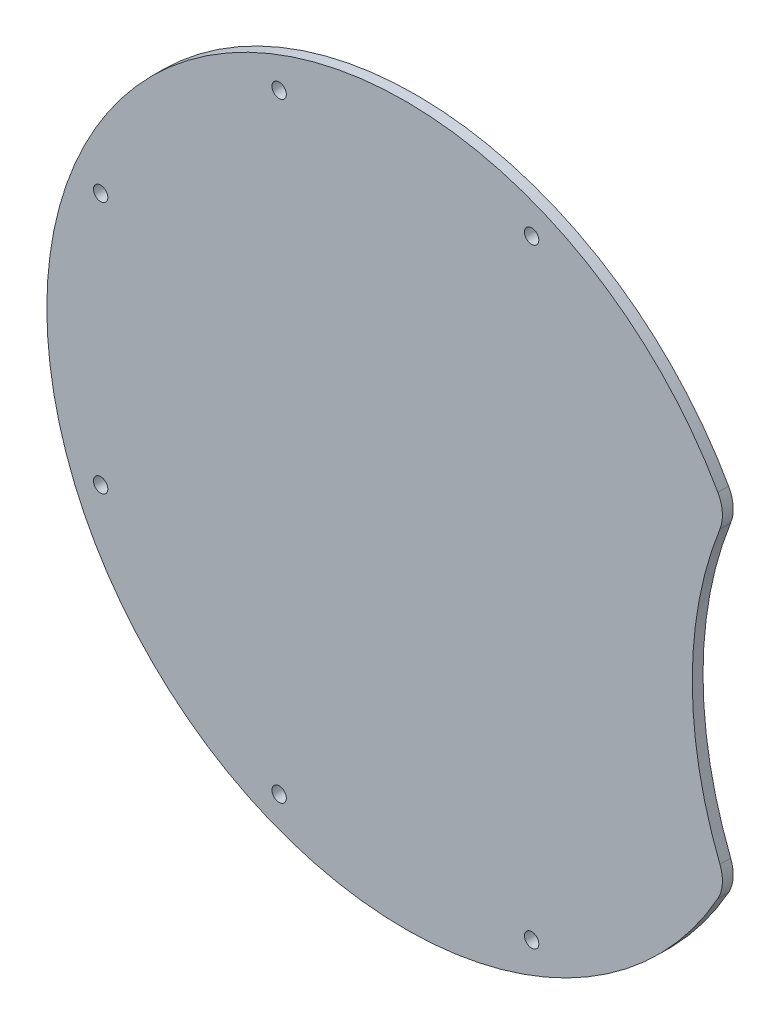
ISO-10303-21;
HEADER;
FILE_DESCRIPTION(('STEP AP214'),'2;1');
FILE_NAME('part.step','',(''),(''),'','','');
FILE_SCHEMA(('AUTOMOTIVE_DESIGN { 1 0 10303 214 1 1 1 1 }'));
ENDSEC;
DATA;
#1=APPLICATION_CONTEXT('core data for automotive mechanical design processes');
#2=APPLICATION_PROTOCOL_DEFINITION('international standard','automotive_design',2000,#1);
#3=PRODUCT_CONTEXT('',#1,'mechanical');
#4=PRODUCT('Part','Part','',(#3));
#5=PRODUCT_RELATED_PRODUCT_CATEGORY('part','',(#4));
#6=PRODUCT_DEFINITION_FORMATION('','',#4);
#7=PRODUCT_DEFINITION_CONTEXT('part definition',#1,'design');
#8=PRODUCT_DEFINITION('design','',#6,#7);
#9=PRODUCT_DEFINITION_SHAPE('','',#8);
#10=(LENGTH_UNIT() NAMED_UNIT(*) SI_UNIT(.MILLI.,.METRE.));
#11=(NAMED_UNIT(*) PLANE_ANGLE_UNIT() SI_UNIT($,.RADIAN.));
#12=(NAMED_UNIT(*) SI_UNIT($,.STERADIAN.) SOLID_ANGLE_UNIT());
#13=UNCERTAINTY_MEASURE_WITH_UNIT(LENGTH_MEASURE(1.E-05),#10,'distance_accuracy_value','');
#14=(GEOMETRIC_REPRESENTATION_CONTEXT(3) GLOBAL_UNCERTAINTY_ASSIGNED_CONTEXT((#13)) GLOBAL_UNIT_ASSIGNED_CONTEXT((#10,
#11,#12)) REPRESENTATION_CONTEXT('',''));
#15=CARTESIAN_POINT('',(0.,0.,0.));
#16=DIRECTION('',(0.,0.,1.));
#17=DIRECTION('',(1.,0.,0.));
#18=AXIS2_PLACEMENT_3D('',#15,#16,#17);
#19=CARTESIAN_POINT('',(0.,0.,3.));
#20=DIRECTION('',(0.,0.,-1.));
#21=DIRECTION('',(-1.,0.,0.));
#22=AXIS2_PLACEMENT_3D('',#19,#20,#21);
#23=CYLINDRICAL_SURFACE('',#22,100.);
#24=CARTESIAN_POINT('',(0.,0.,0.));
#25=DIRECTION('',(0.,0.,1.));
#26=DIRECTION('',(1.,0.,0.));
#27=AXIS2_PLACEMENT_3D('',#24,#25,#26);
#28=CIRCLE('',#27,100.);
#29=CARTESIAN_POINT('',(87.1345029239766,49.0670806161475,0.));
#30=VERTEX_POINT('',#29);
#31=CARTESIAN_POINT('',(87.1345029239766,-49.0670806161475,0.));
#32=VERTEX_POINT('',#31);
#33=EDGE_CURVE('E80',#30,#32,#28,.T.);
#34=ORIENTED_EDGE('',*,*,#33,.T.);
#35=DIRECTION('',(0.,0.,-1.));
#36=VECTOR('',#35,1.);
#37=CARTESIAN_POINT('',(87.1345029239766,-49.0670806161475,3.));
#38=LINE('',#37,#36);
#39=CARTESIAN_POINT('',(87.1345029239766,-49.0670806161475,3.));
#40=VERTEX_POINT('',#39);
#41=EDGE_CURVE('E84',#32,#40,#38,.F.);
#42=ORIENTED_EDGE('',*,*,#41,.T.);
#43=CARTESIAN_POINT('',(0.,0.,3.));
#44=DIRECTION('',(0.,0.,1.));
#45=DIRECTION('',(1.,0.,0.));
#46=AXIS2_PLACEMENT_3D('',#43,#44,#45);
#47=CIRCLE('',#46,100.);
#48=CARTESIAN_POINT('',(87.1345029239766,49.0670806161475,3.));
#49=VERTEX_POINT('',#48);
#50=EDGE_CURVE('E83',#49,#40,#47,.T.);
#51=ORIENTED_EDGE('',*,*,#50,.F.);
#52=DIRECTION('',(0.,0.,-1.));
#53=VECTOR('',#52,1.);
#54=CARTESIAN_POINT('',(87.1345029239766,49.0670806161475,3.));
#55=LINE('',#54,#53);
#56=EDGE_CURVE('E74',#49,#30,#55,.T.);
#57=ORIENTED_EDGE('',*,*,#56,.T.);
#58=EDGE_LOOP('',(#34,#42,#51,#57));
#59=FACE_BOUND('',#58,.T.);
#60=ADVANCED_FACE('F32',(#59),#23,.T.);
#61=CARTESIAN_POINT('',(0.,0.,3.));
#62=DIRECTION('',(0.,0.,1.));
#63=DIRECTION('',(1.,0.,0.));
#64=AXIS2_PLACEMENT_3D('',#61,#62,#63);
#65=PLANE('',#64);
#66=CARTESIAN_POINT('',(35.2068757775834,-84.9969169910385,3.));
#67=DIRECTION('',(0.,0.,-1.));
#68=DIRECTION('',(-1.,0.,0.));
#69=AXIS2_PLACEMENT_3D('',#66,#67,#68);
#70=CIRCLE('',#69,2.00000000000507);
#71=CARTESIAN_POINT('',(33.2068757775783,-84.9969169910385,3.));
#72=VERTEX_POINT('',#71);
#73=EDGE_CURVE('E134',#72,#72,#70,.T.);
#74=ORIENTED_EDGE('',*,*,#73,.T.);
#75=EDGE_LOOP('',(#74));
#76=FACE_BOUND('',#75,.T.);
#77=CARTESIAN_POINT('',(-35.2068757775931,-84.9969169910364,3.));
#78=DIRECTION('',(0.,0.,-1.));
#79=DIRECTION('',(-1.,0.,0.));
#80=AXIS2_PLACEMENT_3D('',#77,#78,#79);
#81=CIRCLE('',#80,2.00000000000583);
#82=CARTESIAN_POINT('',(-37.206875777599,-84.9969169910364,3.));
#83=VERTEX_POINT('',#82);
#84=EDGE_CURVE('E128',#83,#83,#81,.T.);
#85=ORIENTED_EDGE('',*,*,#84,.T.);
#86=EDGE_LOOP('',(#85));
#87=FACE_BOUND('',#86,.T.);
#88=CARTESIAN_POINT('',(-84.9969169910418,-35.2068757775848,3.));
#89=DIRECTION('',(0.,0.,-1.));
#90=DIRECTION('',(-1.,0.,0.));
#91=AXIS2_PLACEMENT_3D('',#88,#89,#90);
#92=CIRCLE('',#91,2.00000000000508);
#93=CARTESIAN_POINT('',(-86.9969169910469,-35.2068757775848,3.));
#94=VERTEX_POINT('',#93);
#95=EDGE_CURVE('E122',#94,#94,#92,.T.);
#96=ORIENTED_EDGE('',*,*,#95,.T.);
#97=EDGE_LOOP('',(#96));
#98=FACE_BOUND('',#97,.T.);
#99=CARTESIAN_POINT('',(-84.9969169910398,35.2068757775917,3.));
#100=DIRECTION('',(0.,0.,-1.));
#101=DIRECTION('',(-1.,0.,0.));
#102=AXIS2_PLACEMENT_3D('',#99,#100,#101);
#103=CIRCLE('',#102,2.00000000000313);
#104=CARTESIAN_POINT('',(-86.9969169910429,35.2068757775917,3.));
#105=VERTEX_POINT('',#104);
#106=EDGE_CURVE('E116',#105,#105,#103,.T.);
#107=ORIENTED_EDGE('',*,*,#106,.T.);
#108=EDGE_LOOP('',(#107));
#109=FACE_BOUND('',#108,.T.);
#110=CARTESIAN_POINT('',(-35.2068757775884,84.9969169910384,3.));
#111=DIRECTION('',(0.,0.,-1.));
#112=DIRECTION('',(-1.,0.,0.));
#113=AXIS2_PLACEMENT_3D('',#110,#111,#112);
#114=CIRCLE('',#113,2.00000000000001);
#115=CARTESIAN_POINT('',(-37.2068757775884,84.9969169910384,3.));
#116=VERTEX_POINT('',#115);
#117=EDGE_CURVE('E111',#116,#116,#114,.T.);
#118=ORIENTED_EDGE('',*,*,#117,.T.);
#119=EDGE_LOOP('',(#118));
#120=FACE_BOUND('',#119,.T.);
#121=CARTESIAN_POINT('',(35.2068757775883,84.9969169910384,3.));
#122=DIRECTION('',(0.,0.,-1.));
#123=DIRECTION('',(-1.,0.,0.));
#124=AXIS2_PLACEMENT_3D('',#121,#122,#123);
#125=CIRCLE('',#124,2.);
#126=CARTESIAN_POINT('',(33.2068757775883,84.9969169910384,3.));
#127=VERTEX_POINT('',#126);
#128=EDGE_CURVE('E105',#127,#127,#125,.T.);
#129=ORIENTED_EDGE('',*,*,#128,.T.);
#130=EDGE_LOOP('',(#129));
#131=FACE_BOUND('',#130,.T.);
#132=ORIENTED_EDGE('',*,*,#50,.T.);
#133=CARTESIAN_POINT('',(78.4210526315789,-44.1603725545327,3.));
#134=DIRECTION('',(0.,0.,1.));
#135=DIRECTION('',(1.,0.,0.));
#136=AXIS2_PLACEMENT_3D('',#133,#134,#135);
#137=CIRCLE('',#136,10.);
#138=CARTESIAN_POINT('',(87.719298245614,-40.4803415083217,3.));
#139=VERTEX_POINT('',#138);
#140=EDGE_CURVE('E98',#40,#139,#137,.T.);
#141=ORIENTED_EDGE('',*,*,#140,.T.);
#142=CARTESIAN_POINT('',(190.,0.,3.));
#143=DIRECTION('',(0.,0.,1.));
#144=DIRECTION('',(1.,0.,0.));
#145=AXIS2_PLACEMENT_3D('',#142,#143,#144);
#146=CIRCLE('',#145,110.);
#147=CARTESIAN_POINT('',(87.719298245614,40.4803415083217,3.));
#148=VERTEX_POINT('',#147);
#149=EDGE_CURVE('E91',#148,#139,#146,.T.);
#150=ORIENTED_EDGE('',*,*,#149,.F.);
#151=CARTESIAN_POINT('',(78.4210526315789,44.1603725545327,3.));
#152=DIRECTION('',(0.,0.,1.));
#153=DIRECTION('',(1.,0.,0.));
#154=AXIS2_PLACEMENT_3D('',#151,#152,#153);
#155=CIRCLE('',#154,10.);
#156=EDGE_CURVE('E96',#148,#49,#155,.T.);
#157=ORIENTED_EDGE('',*,*,#156,.T.);
#158=EDGE_LOOP('',(#132,#141,#150,#157));
#159=FACE_BOUND('',#158,.T.);
#160=ADVANCED_FACE('F104',(#76,#87,#98,#109,#120,#131,#159),#65,.T.);
#161=CARTESIAN_POINT('',(0.,0.,0.));
#162=DIRECTION('',(0.,0.,1.));
#163=DIRECTION('',(1.,0.,0.));
#164=AXIS2_PLACEMENT_3D('',#161,#162,#163);
#165=PLANE('',#164);
#166=CARTESIAN_POINT('',(35.2068757775834,-84.9969169910385,0.));
#167=DIRECTION('',(0.,0.,-1.));
#168=DIRECTION('',(-1.,0.,0.));
#169=AXIS2_PLACEMENT_3D('',#166,#167,#168);
#170=CIRCLE('',#169,2.00000000000507);
#171=CARTESIAN_POINT('',(33.2068757775783,-84.9969169910385,0.));
#172=VERTEX_POINT('',#171);
#173=EDGE_CURVE('E137',#172,#172,#170,.T.);
#174=ORIENTED_EDGE('',*,*,#173,.F.);
#175=EDGE_LOOP('',(#174));
#176=FACE_BOUND('',#175,.T.);
#177=CARTESIAN_POINT('',(-35.2068757775931,-84.9969169910364,0.));
#178=DIRECTION('',(0.,0.,-1.));
#179=DIRECTION('',(-1.,0.,0.));
#180=AXIS2_PLACEMENT_3D('',#177,#178,#179);
#181=CIRCLE('',#180,2.00000000000583);
#182=CARTESIAN_POINT('',(-37.206875777599,-84.9969169910364,0.));
#183=VERTEX_POINT('',#182);
#184=EDGE_CURVE('E131',#183,#183,#181,.T.);
#185=ORIENTED_EDGE('',*,*,#184,.F.);
#186=EDGE_LOOP('',(#185));
#187=FACE_BOUND('',#186,.T.);
#188=CARTESIAN_POINT('',(-84.9969169910418,-35.2068757775848,0.));
#189=DIRECTION('',(0.,0.,-1.));
#190=DIRECTION('',(-1.,0.,0.));
#191=AXIS2_PLACEMENT_3D('',#188,#189,#190);
#192=CIRCLE('',#191,2.00000000000508);
#193=CARTESIAN_POINT('',(-86.9969169910469,-35.2068757775848,0.));
#194=VERTEX_POINT('',#193);
#195=EDGE_CURVE('E125',#194,#194,#192,.T.);
#196=ORIENTED_EDGE('',*,*,#195,.F.);
#197=EDGE_LOOP('',(#196));
#198=FACE_BOUND('',#197,.T.);
#199=CARTESIAN_POINT('',(-84.9969169910398,35.2068757775917,0.));
#200=DIRECTION('',(0.,0.,-1.));
#201=DIRECTION('',(-1.,0.,0.));
#202=AXIS2_PLACEMENT_3D('',#199,#200,#201);
#203=CIRCLE('',#202,2.00000000000313);
#204=CARTESIAN_POINT('',(-86.9969169910429,35.2068757775917,0.));
#205=VERTEX_POINT('',#204);
#206=EDGE_CURVE('E119',#205,#205,#203,.T.);
#207=ORIENTED_EDGE('',*,*,#206,.F.);
#208=EDGE_LOOP('',(#207));
#209=FACE_BOUND('',#208,.T.);
#210=CARTESIAN_POINT('',(-35.2068757775884,84.9969169910384,0.));
#211=DIRECTION('',(0.,0.,-1.));
#212=DIRECTION('',(-1.,0.,0.));
#213=AXIS2_PLACEMENT_3D('',#210,#211,#212);
#214=CIRCLE('',#213,2.00000000000001);
#215=CARTESIAN_POINT('',(-37.2068757775884,84.9969169910384,0.));
#216=VERTEX_POINT('',#215);
#217=EDGE_CURVE('E113',#216,#216,#214,.T.);
#218=ORIENTED_EDGE('',*,*,#217,.F.);
#219=EDGE_LOOP('',(#218));
#220=FACE_BOUND('',#219,.T.);
#221=CARTESIAN_POINT('',(35.2068757775883,84.9969169910384,0.));
#222=DIRECTION('',(0.,0.,-1.));
#223=DIRECTION('',(-1.,0.,0.));
#224=AXIS2_PLACEMENT_3D('',#221,#222,#223);
#225=CIRCLE('',#224,2.);
#226=CARTESIAN_POINT('',(33.2068757775883,84.9969169910384,0.));
#227=VERTEX_POINT('',#226);
#228=EDGE_CURVE('E107',#227,#227,#225,.T.);
#229=ORIENTED_EDGE('',*,*,#228,.F.);
#230=EDGE_LOOP('',(#229));
#231=FACE_BOUND('',#230,.T.);
#232=CARTESIAN_POINT('',(190.,0.,0.));
#233=DIRECTION('',(0.,0.,1.));
#234=DIRECTION('',(1.,0.,0.));
#235=AXIS2_PLACEMENT_3D('',#232,#233,#234);
#236=CIRCLE('',#235,110.);
#237=CARTESIAN_POINT('',(87.719298245614,40.4803415083217,0.));
#238=VERTEX_POINT('',#237);
#239=CARTESIAN_POINT('',(87.719298245614,-40.4803415083217,0.));
#240=VERTEX_POINT('',#239);
#241=EDGE_CURVE('E88',#238,#240,#236,.T.);
#242=ORIENTED_EDGE('',*,*,#241,.T.);
#243=CARTESIAN_POINT('',(78.4210526315789,-44.1603725545327,0.));
#244=DIRECTION('',(0.,0.,1.));
#245=DIRECTION('',(1.,0.,0.));
#246=AXIS2_PLACEMENT_3D('',#243,#244,#245);
#247=CIRCLE('',#246,10.);
#248=EDGE_CURVE('E11',#240,#32,#247,.F.);
#249=ORIENTED_EDGE('',*,*,#248,.T.);
#250=ORIENTED_EDGE('',*,*,#33,.F.);
#251=CARTESIAN_POINT('',(78.4210526315789,44.1603725545327,0.));
#252=DIRECTION('',(0.,0.,1.));
#253=DIRECTION('',(1.,0.,0.));
#254=AXIS2_PLACEMENT_3D('',#251,#252,#253);
#255=CIRCLE('',#254,10.);
#256=EDGE_CURVE('E40',#30,#238,#255,.F.);
#257=ORIENTED_EDGE('',*,*,#256,.T.);
#258=EDGE_LOOP('',(#242,#249,#250,#257));
#259=FACE_BOUND('',#258,.T.);
#260=ADVANCED_FACE('F86',(#176,#187,#198,#209,#220,#231,#259),#165,.F.);
#261=CARTESIAN_POINT('',(190.,0.,0.));
#262=DIRECTION('',(0.,0.,1.));
#263=DIRECTION('',(1.,0.,0.));
#264=AXIS2_PLACEMENT_3D('',#261,#262,#263);
#265=CYLINDRICAL_SURFACE('',#264,110.);
#266=ORIENTED_EDGE('',*,*,#149,.T.);
#267=DIRECTION('',(0.,0.,1.));
#268=VECTOR('',#267,1.);
#269=CARTESIAN_POINT('',(87.719298245614,-40.4803415083217,0.));
#270=LINE('',#269,#268);
#271=EDGE_CURVE('E47',#139,#240,#270,.F.);
#272=ORIENTED_EDGE('',*,*,#271,.T.);
#273=ORIENTED_EDGE('',*,*,#241,.F.);
#274=DIRECTION('',(0.,0.,1.));
#275=VECTOR('',#274,1.);
#276=CARTESIAN_POINT('',(87.719298245614,40.4803415083217,0.));
#277=LINE('',#276,#275);
#278=EDGE_CURVE('E75',#238,#148,#277,.T.);
#279=ORIENTED_EDGE('',*,*,#278,.T.);
#280=EDGE_LOOP('',(#266,#272,#273,#279));
#281=FACE_BOUND('',#280,.T.);
#282=ADVANCED_FACE('F102',(#281),#265,.F.);
#283=CARTESIAN_POINT('',(78.4210526315789,-44.1603725545327,0.));
#284=DIRECTION('',(0.,0.,-1.));
#285=DIRECTION('',(-1.,0.,0.));
#286=AXIS2_PLACEMENT_3D('',#283,#284,#285);
#287=CYLINDRICAL_SURFACE('',#286,10.);
#288=ORIENTED_EDGE('',*,*,#248,.F.);
#289=ORIENTED_EDGE('',*,*,#271,.F.);
#290=ORIENTED_EDGE('',*,*,#140,.F.);
#291=ORIENTED_EDGE('',*,*,#41,.F.);
#292=EDGE_LOOP('',(#288,#289,#290,#291));
#293=FACE_BOUND('',#292,.T.);
#294=ADVANCED_FACE('F177',(#293),#287,.T.);
#295=CARTESIAN_POINT('',(78.4210526315789,44.1603725545327,0.));
#296=DIRECTION('',(0.,0.,1.));
#297=DIRECTION('',(1.,0.,0.));
#298=AXIS2_PLACEMENT_3D('',#295,#296,#297);
#299=CYLINDRICAL_SURFACE('',#298,10.);
#300=ORIENTED_EDGE('',*,*,#156,.F.);
#301=ORIENTED_EDGE('',*,*,#278,.F.);
#302=ORIENTED_EDGE('',*,*,#256,.F.);
#303=ORIENTED_EDGE('',*,*,#56,.F.);
#304=EDGE_LOOP('',(#300,#301,#302,#303));
#305=FACE_BOUND('',#304,.T.);
#306=ADVANCED_FACE('F34',(#305),#299,.T.);
#307=CARTESIAN_POINT('',(35.2068757775883,84.9969169910384,3.));
#308=DIRECTION('',(0.,0.,-1.));
#309=DIRECTION('',(-1.,0.,0.));
#310=AXIS2_PLACEMENT_3D('',#307,#308,#309);
#311=CYLINDRICAL_SURFACE('',#310,2.);
#312=ORIENTED_EDGE('',*,*,#128,.F.);
#313=EDGE_LOOP('',(#312));
#314=FACE_BOUND('',#313,.T.);
#315=ORIENTED_EDGE('',*,*,#228,.T.);
#316=EDGE_LOOP('',(#315));
#317=FACE_BOUND('',#316,.T.);
#318=ADVANCED_FACE('F165',(#314,#317),#311,.F.);
#319=CARTESIAN_POINT('',(-35.2068757775884,84.9969169910384,3.));
#320=DIRECTION('',(0.,0.,-1.));
#321=DIRECTION('',(-1.,0.,0.));
#322=AXIS2_PLACEMENT_3D('',#319,#320,#321);
#323=CYLINDRICAL_SURFACE('',#322,2.00000000000001);
#324=ORIENTED_EDGE('',*,*,#117,.F.);
#325=EDGE_LOOP('',(#324));
#326=FACE_BOUND('',#325,.T.);
#327=ORIENTED_EDGE('',*,*,#217,.T.);
#328=EDGE_LOOP('',(#327));
#329=FACE_BOUND('',#328,.T.);
#330=ADVANCED_FACE('F167',(#326,#329),#323,.F.);
#331=CARTESIAN_POINT('',(-84.9969169910398,35.2068757775917,3.));
#332=DIRECTION('',(0.,0.,-1.));
#333=DIRECTION('',(-1.,0.,0.));
#334=AXIS2_PLACEMENT_3D('',#331,#332,#333);
#335=CYLINDRICAL_SURFACE('',#334,2.00000000000313);
#336=ORIENTED_EDGE('',*,*,#106,.F.);
#337=EDGE_LOOP('',(#336));
#338=FACE_BOUND('',#337,.T.);
#339=ORIENTED_EDGE('',*,*,#206,.T.);
#340=EDGE_LOOP('',(#339));
#341=FACE_BOUND('',#340,.T.);
#342=ADVANCED_FACE('F174',(#338,#341),#335,.F.);
#343=CARTESIAN_POINT('',(-84.9969169910418,-35.2068757775848,3.));
#344=DIRECTION('',(0.,0.,-1.));
#345=DIRECTION('',(-1.,0.,0.));
#346=AXIS2_PLACEMENT_3D('',#343,#344,#345);
#347=CYLINDRICAL_SURFACE('',#346,2.00000000000508);
#348=ORIENTED_EDGE('',*,*,#95,.F.);
#349=EDGE_LOOP('',(#348));
#350=FACE_BOUND('',#349,.T.);
#351=ORIENTED_EDGE('',*,*,#195,.T.);
#352=EDGE_LOOP('',(#351));
#353=FACE_BOUND('',#352,.T.);
#354=ADVANCED_FACE('F235',(#350,#353),#347,.F.);
#355=CARTESIAN_POINT('',(-35.2068757775931,-84.9969169910364,3.));
#356=DIRECTION('',(0.,0.,-1.));
#357=DIRECTION('',(-1.,0.,0.));
#358=AXIS2_PLACEMENT_3D('',#355,#356,#357);
#359=CYLINDRICAL_SURFACE('',#358,2.00000000000583);
#360=ORIENTED_EDGE('',*,*,#84,.F.);
#361=EDGE_LOOP('',(#360));
#362=FACE_BOUND('',#361,.T.);
#363=ORIENTED_EDGE('',*,*,#184,.T.);
#364=EDGE_LOOP('',(#363));
#365=FACE_BOUND('',#364,.T.);
#366=ADVANCED_FACE('F148',(#362,#365),#359,.F.);
#367=CARTESIAN_POINT('',(35.2068757775834,-84.9969169910385,3.));
#368=DIRECTION('',(0.,0.,-1.));
#369=DIRECTION('',(-1.,0.,0.));
#370=AXIS2_PLACEMENT_3D('',#367,#368,#369);
#371=CYLINDRICAL_SURFACE('',#370,2.00000000000507);
#372=ORIENTED_EDGE('',*,*,#73,.F.);
#373=EDGE_LOOP('',(#372));
#374=FACE_BOUND('',#373,.T.);
#375=ORIENTED_EDGE('',*,*,#173,.T.);
#376=EDGE_LOOP('',(#375));
#377=FACE_BOUND('',#376,.T.);
#378=ADVANCED_FACE('F145',(#374,#377),#371,.F.);
#379=CLOSED_SHELL('',(#60,#160,#260,#282,#294,#306,#318,#330,#342,#354,#366,#378));
#380=MANIFOLD_SOLID_BREP('B2',#379);
#381=ADVANCED_BREP_SHAPE_REPRESENTATION('',(#18,#380),#14);
#382=SHAPE_DEFINITION_REPRESENTATION(#9,#381);
ENDSEC;
END-ISO-10303-21;
